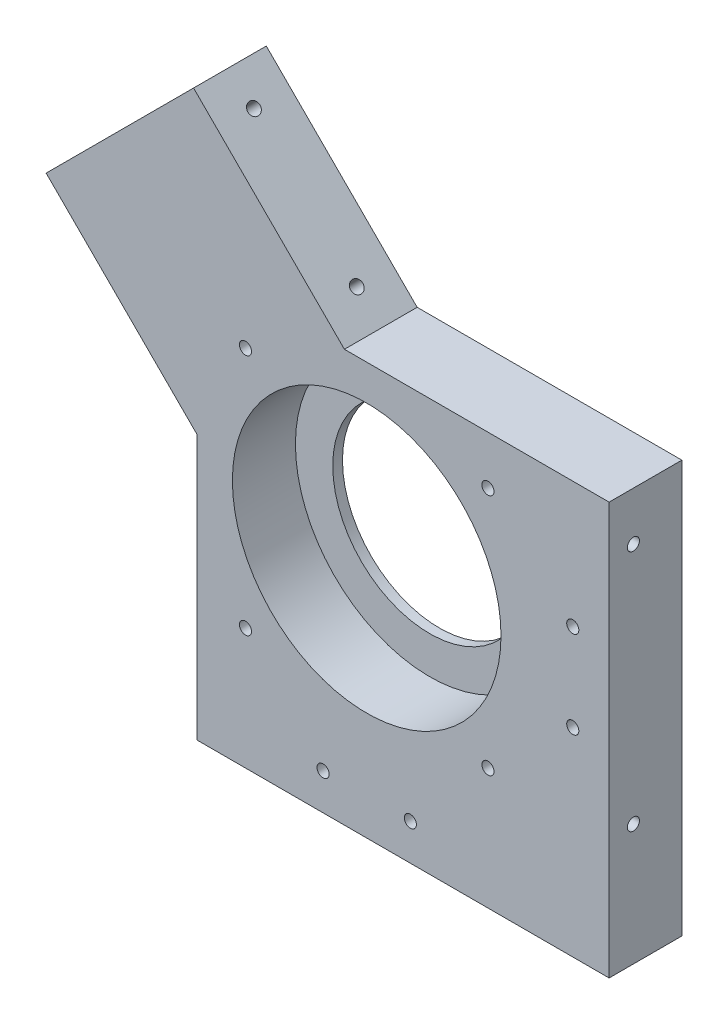
ISO-10303-21;
HEADER;
FILE_DESCRIPTION(('STEP AP214'),'2;1');
FILE_NAME('part.step','',(''),(''),'','','');
FILE_SCHEMA(('AUTOMOTIVE_DESIGN { 1 0 10303 214 1 1 1 1 }'));
ENDSEC;
DATA;
#1=APPLICATION_CONTEXT('core data for automotive mechanical design processes');
#2=APPLICATION_PROTOCOL_DEFINITION('international standard','automotive_design',2000,#1);
#3=PRODUCT_CONTEXT('',#1,'mechanical');
#4=PRODUCT('Part','Part','',(#3));
#5=PRODUCT_RELATED_PRODUCT_CATEGORY('part','',(#4));
#6=PRODUCT_DEFINITION_FORMATION('','',#4);
#7=PRODUCT_DEFINITION_CONTEXT('part definition',#1,'design');
#8=PRODUCT_DEFINITION('design','',#6,#7);
#9=PRODUCT_DEFINITION_SHAPE('','',#8);
#10=(LENGTH_UNIT() NAMED_UNIT(*) SI_UNIT(.MILLI.,.METRE.));
#11=(NAMED_UNIT(*) PLANE_ANGLE_UNIT() SI_UNIT($,.RADIAN.));
#12=(NAMED_UNIT(*) SI_UNIT($,.STERADIAN.) SOLID_ANGLE_UNIT());
#13=UNCERTAINTY_MEASURE_WITH_UNIT(LENGTH_MEASURE(1.E-05),#10,'distance_accuracy_value','');
#14=(GEOMETRIC_REPRESENTATION_CONTEXT(3) GLOBAL_UNCERTAINTY_ASSIGNED_CONTEXT((#13)) GLOBAL_UNIT_ASSIGNED_CONTEXT((#10,
#11,#12)) REPRESENTATION_CONTEXT('',''));
#15=CARTESIAN_POINT('',(0.,0.,0.));
#16=DIRECTION('',(0.,0.,1.));
#17=DIRECTION('',(1.,0.,0.));
#18=AXIS2_PLACEMENT_3D('',#15,#16,#17);
#19=CARTESIAN_POINT('',(0.,0.,15.));
#20=DIRECTION('',(0.,0.,-1.));
#21=DIRECTION('',(-1.,0.,0.));
#22=AXIS2_PLACEMENT_3D('',#19,#20,#21);
#23=CYLINDRICAL_SURFACE('',#22,27.7);
#24=CARTESIAN_POINT('',(0.,0.,15.));
#25=DIRECTION('',(0.,0.,1.));
#26=DIRECTION('',(1.,0.,0.));
#27=AXIS2_PLACEMENT_3D('',#24,#25,#26);
#28=CIRCLE('',#27,27.7);
#29=CARTESIAN_POINT('',(27.7,0.,15.));
#30=VERTEX_POINT('',#29);
#31=EDGE_CURVE('E129',#30,#30,#28,.T.);
#32=ORIENTED_EDGE('',*,*,#31,.T.);
#33=EDGE_LOOP('',(#32));
#34=FACE_BOUND('',#33,.T.);
#35=CARTESIAN_POINT('',(0.,0.,2.));
#36=DIRECTION('',(0.,0.,-1.));
#37=DIRECTION('',(-1.,0.,0.));
#38=AXIS2_PLACEMENT_3D('',#35,#36,#37);
#39=CIRCLE('',#38,27.7);
#40=CARTESIAN_POINT('',(-27.7,0.,2.));
#41=VERTEX_POINT('',#40);
#42=EDGE_CURVE('E232',#41,#41,#39,.T.);
#43=ORIENTED_EDGE('',*,*,#42,.T.);
#44=EDGE_LOOP('',(#43));
#45=FACE_BOUND('',#44,.T.);
#46=ADVANCED_FACE('F33',(#34,#45),#23,.F.);
#47=CARTESIAN_POINT('',(0.,0.,15.));
#48=DIRECTION('',(0.,0.,-1.));
#49=DIRECTION('',(-1.,0.,0.));
#50=AXIS2_PLACEMENT_3D('',#47,#48,#49);
#51=PLANE('',#50);
#52=DIRECTION('',(-1.,0.,0.));
#53=VECTOR('',#52,1.);
#54=CARTESIAN_POINT('',(-4.59440840897849,35.,15.));
#55=LINE('',#54,#53);
#56=CARTESIAN_POINT('',(50.,35.,15.));
#57=VERTEX_POINT('',#56);
#58=CARTESIAN_POINT('',(-4.59440840897849,35.,15.));
#59=VERTEX_POINT('',#58);
#60=EDGE_CURVE('E139',#57,#59,#55,.T.);
#61=ORIENTED_EDGE('',*,*,#60,.T.);
#62=DIRECTION('',(-0.707106781186547,0.707106781186548,0.));
#63=VECTOR('',#62,1.);
#64=CARTESIAN_POINT('',(-35.7088924499206,66.1144840409422,15.));
#65=LINE('',#64,#63);
#66=CARTESIAN_POINT('',(-35.7088924499206,66.1144840409422,15.));
#67=VERTEX_POINT('',#66);
#68=EDGE_CURVE('E90',#59,#67,#65,.T.);
#69=ORIENTED_EDGE('',*,*,#68,.T.);
#70=DIRECTION('',(-0.707106781186548,-0.707106781186547,0.));
#71=VECTOR('',#70,1.);
#72=CARTESIAN_POINT('',(-50.9116882454314,50.9116882454314,15.));
#73=LINE('',#72,#71);
#74=CARTESIAN_POINT('',(-66.1144840409422,35.7088924499207,15.));
#75=VERTEX_POINT('',#74);
#76=EDGE_CURVE('E150',#67,#75,#73,.T.);
#77=ORIENTED_EDGE('',*,*,#76,.T.);
#78=DIRECTION('',(0.707106781186547,-0.707106781186548,0.));
#79=VECTOR('',#78,1.);
#80=CARTESIAN_POINT('',(-66.1144840409422,35.7088924499207,15.));
#81=LINE('',#80,#79);
#82=CARTESIAN_POINT('',(-35.,4.59440840897844,15.));
#83=VERTEX_POINT('',#82);
#84=EDGE_CURVE('E107',#75,#83,#81,.T.);
#85=ORIENTED_EDGE('',*,*,#84,.T.);
#86=DIRECTION('',(0.,-1.,0.));
#87=VECTOR('',#86,1.);
#88=CARTESIAN_POINT('',(-35.,-50.,15.));
#89=LINE('',#88,#87);
#90=CARTESIAN_POINT('',(-35.,-50.,15.));
#91=VERTEX_POINT('',#90);
#92=EDGE_CURVE('E100',#83,#91,#89,.T.);
#93=ORIENTED_EDGE('',*,*,#92,.T.);
#94=DIRECTION('',(1.,0.,0.));
#95=VECTOR('',#94,1.);
#96=CARTESIAN_POINT('',(50.,-50.,15.));
#97=LINE('',#96,#95);
#98=CARTESIAN_POINT('',(50.,-50.,15.));
#99=VERTEX_POINT('',#98);
#100=EDGE_CURVE('E105',#91,#99,#97,.T.);
#101=ORIENTED_EDGE('',*,*,#100,.T.);
#102=DIRECTION('',(0.,1.,0.));
#103=VECTOR('',#102,1.);
#104=CARTESIAN_POINT('',(50.,35.,15.));
#105=LINE('',#104,#103);
#106=EDGE_CURVE('E50',#99,#57,#105,.T.);
#107=ORIENTED_EDGE('',*,*,#106,.T.);
#108=EDGE_LOOP('',(#61,#69,#77,#85,#93,#101,#107));
#109=FACE_BOUND('',#108,.T.);
#110=ORIENTED_EDGE('',*,*,#31,.F.);
#111=EDGE_LOOP('',(#110));
#112=FACE_BOUND('',#111,.T.);
#113=CARTESIAN_POINT('',(42.5,9.,15.));
#114=DIRECTION('',(0.,0.,1.));
#115=DIRECTION('',(1.,0.,0.));
#116=AXIS2_PLACEMENT_3D('',#113,#114,#115);
#117=CIRCLE('',#116,1.25);
#118=CARTESIAN_POINT('',(43.75,9.,15.));
#119=VERTEX_POINT('',#118);
#120=EDGE_CURVE('E166',#119,#119,#117,.T.);
#121=ORIENTED_EDGE('',*,*,#120,.F.);
#122=EDGE_LOOP('',(#121));
#123=FACE_BOUND('',#122,.T.);
#124=CARTESIAN_POINT('',(-25.,25.,15.));
#125=DIRECTION('',(0.,0.,1.));
#126=DIRECTION('',(1.,0.,0.));
#127=AXIS2_PLACEMENT_3D('',#124,#125,#126);
#128=CIRCLE('',#127,1.25);
#129=CARTESIAN_POINT('',(-23.75,25.,15.));
#130=VERTEX_POINT('',#129);
#131=EDGE_CURVE('E170',#130,#130,#128,.T.);
#132=ORIENTED_EDGE('',*,*,#131,.F.);
#133=EDGE_LOOP('',(#132));
#134=FACE_BOUND('',#133,.T.);
#135=CARTESIAN_POINT('',(25.,25.,15.));
#136=DIRECTION('',(0.,0.,1.));
#137=DIRECTION('',(1.,0.,0.));
#138=AXIS2_PLACEMENT_3D('',#135,#136,#137);
#139=CIRCLE('',#138,1.25);
#140=CARTESIAN_POINT('',(26.25,25.,15.));
#141=VERTEX_POINT('',#140);
#142=EDGE_CURVE('E176',#141,#141,#139,.T.);
#143=ORIENTED_EDGE('',*,*,#142,.F.);
#144=EDGE_LOOP('',(#143));
#145=FACE_BOUND('',#144,.T.);
#146=CARTESIAN_POINT('',(25.,-25.,15.));
#147=DIRECTION('',(0.,0.,1.));
#148=DIRECTION('',(1.,0.,0.));
#149=AXIS2_PLACEMENT_3D('',#146,#147,#148);
#150=CIRCLE('',#149,1.25);
#151=CARTESIAN_POINT('',(26.25,-25.,15.));
#152=VERTEX_POINT('',#151);
#153=EDGE_CURVE('E182',#152,#152,#150,.T.);
#154=ORIENTED_EDGE('',*,*,#153,.F.);
#155=EDGE_LOOP('',(#154));
#156=FACE_BOUND('',#155,.T.);
#157=CARTESIAN_POINT('',(-25.,-25.,15.));
#158=DIRECTION('',(0.,0.,1.));
#159=DIRECTION('',(1.,0.,0.));
#160=AXIS2_PLACEMENT_3D('',#157,#158,#159);
#161=CIRCLE('',#160,1.25);
#162=CARTESIAN_POINT('',(-23.75,-25.,15.));
#163=VERTEX_POINT('',#162);
#164=EDGE_CURVE('E188',#163,#163,#161,.T.);
#165=ORIENTED_EDGE('',*,*,#164,.F.);
#166=EDGE_LOOP('',(#165));
#167=FACE_BOUND('',#166,.T.);
#168=CARTESIAN_POINT('',(42.5,-9.,15.));
#169=DIRECTION('',(0.,0.,1.));
#170=DIRECTION('',(1.,0.,0.));
#171=AXIS2_PLACEMENT_3D('',#168,#169,#170);
#172=CIRCLE('',#171,1.25);
#173=CARTESIAN_POINT('',(43.75,-9.,15.));
#174=VERTEX_POINT('',#173);
#175=EDGE_CURVE('E194',#174,#174,#172,.T.);
#176=ORIENTED_EDGE('',*,*,#175,.F.);
#177=EDGE_LOOP('',(#176));
#178=FACE_BOUND('',#177,.T.);
#179=CARTESIAN_POINT('',(9.00000000000001,-42.5,15.));
#180=DIRECTION('',(0.,0.,1.));
#181=DIRECTION('',(1.,0.,0.));
#182=AXIS2_PLACEMENT_3D('',#179,#180,#181);
#183=CIRCLE('',#182,1.25);
#184=CARTESIAN_POINT('',(10.25,-42.5,15.));
#185=VERTEX_POINT('',#184);
#186=EDGE_CURVE('E200',#185,#185,#183,.T.);
#187=ORIENTED_EDGE('',*,*,#186,.F.);
#188=EDGE_LOOP('',(#187));
#189=FACE_BOUND('',#188,.T.);
#190=CARTESIAN_POINT('',(-8.99999999999999,-42.5,15.));
#191=DIRECTION('',(0.,0.,1.));
#192=DIRECTION('',(1.,0.,0.));
#193=AXIS2_PLACEMENT_3D('',#190,#191,#192);
#194=CIRCLE('',#193,1.25);
#195=CARTESIAN_POINT('',(-7.74999999999999,-42.5,15.));
#196=VERTEX_POINT('',#195);
#197=EDGE_CURVE('E206',#196,#196,#194,.T.);
#198=ORIENTED_EDGE('',*,*,#197,.F.);
#199=EDGE_LOOP('',(#198));
#200=FACE_BOUND('',#199,.T.);
#201=ADVANCED_FACE('F102',(#109,#112,#123,#134,#145,#156,#167,#178,#189,#200),#51,.F.);
#202=CARTESIAN_POINT('',(0.,0.,0.));
#203=DIRECTION('',(0.,0.,-1.));
#204=DIRECTION('',(-1.,0.,0.));
#205=AXIS2_PLACEMENT_3D('',#202,#203,#204);
#206=PLANE('',#205);
#207=CARTESIAN_POINT('',(9.00000000000001,-42.5,0.));
#208=DIRECTION('',(0.,0.,1.));
#209=DIRECTION('',(1.,0.,0.));
#210=AXIS2_PLACEMENT_3D('',#207,#208,#209);
#211=CIRCLE('',#210,1.25);
#212=CARTESIAN_POINT('',(10.25,-42.5,0.));
#213=VERTEX_POINT('',#212);
#214=EDGE_CURVE('E203',#213,#213,#211,.T.);
#215=ORIENTED_EDGE('',*,*,#214,.T.);
#216=EDGE_LOOP('',(#215));
#217=FACE_BOUND('',#216,.T.);
#218=CARTESIAN_POINT('',(-25.,-25.,0.));
#219=DIRECTION('',(0.,0.,1.));
#220=DIRECTION('',(1.,0.,0.));
#221=AXIS2_PLACEMENT_3D('',#218,#219,#220);
#222=CIRCLE('',#221,1.25);
#223=CARTESIAN_POINT('',(-23.75,-25.,0.));
#224=VERTEX_POINT('',#223);
#225=EDGE_CURVE('E191',#224,#224,#222,.T.);
#226=ORIENTED_EDGE('',*,*,#225,.T.);
#227=EDGE_LOOP('',(#226));
#228=FACE_BOUND('',#227,.T.);
#229=CARTESIAN_POINT('',(25.,25.,0.));
#230=DIRECTION('',(0.,0.,1.));
#231=DIRECTION('',(1.,0.,0.));
#232=AXIS2_PLACEMENT_3D('',#229,#230,#231);
#233=CIRCLE('',#232,1.25);
#234=CARTESIAN_POINT('',(26.25,25.,0.));
#235=VERTEX_POINT('',#234);
#236=EDGE_CURVE('E179',#235,#235,#233,.T.);
#237=ORIENTED_EDGE('',*,*,#236,.T.);
#238=EDGE_LOOP('',(#237));
#239=FACE_BOUND('',#238,.T.);
#240=CARTESIAN_POINT('',(42.5,9.,0.));
#241=DIRECTION('',(0.,0.,1.));
#242=DIRECTION('',(1.,0.,0.));
#243=AXIS2_PLACEMENT_3D('',#240,#241,#242);
#244=CIRCLE('',#243,1.25);
#245=CARTESIAN_POINT('',(43.75,9.,0.));
#246=VERTEX_POINT('',#245);
#247=EDGE_CURVE('E167',#246,#246,#244,.T.);
#248=ORIENTED_EDGE('',*,*,#247,.T.);
#249=EDGE_LOOP('',(#248));
#250=FACE_BOUND('',#249,.T.);
#251=DIRECTION('',(-1.,0.,0.));
#252=VECTOR('',#251,1.);
#253=CARTESIAN_POINT('',(-4.59440840897849,35.,0.));
#254=LINE('',#253,#252);
#255=CARTESIAN_POINT('',(50.,35.,0.));
#256=VERTEX_POINT('',#255);
#257=CARTESIAN_POINT('',(-4.59440840897849,35.,0.));
#258=VERTEX_POINT('',#257);
#259=EDGE_CURVE('E125',#256,#258,#254,.T.);
#260=ORIENTED_EDGE('',*,*,#259,.F.);
#261=DIRECTION('',(0.,1.,0.));
#262=VECTOR('',#261,1.);
#263=CARTESIAN_POINT('',(50.,35.,0.));
#264=LINE('',#263,#262);
#265=CARTESIAN_POINT('',(50.,-50.,0.));
#266=VERTEX_POINT('',#265);
#267=EDGE_CURVE('E82',#266,#256,#264,.T.);
#268=ORIENTED_EDGE('',*,*,#267,.F.);
#269=DIRECTION('',(1.,0.,0.));
#270=VECTOR('',#269,1.);
#271=CARTESIAN_POINT('',(50.,-50.,0.));
#272=LINE('',#271,#270);
#273=CARTESIAN_POINT('',(-35.,-50.,0.));
#274=VERTEX_POINT('',#273);
#275=EDGE_CURVE('E76',#274,#266,#272,.T.);
#276=ORIENTED_EDGE('',*,*,#275,.F.);
#277=DIRECTION('',(0.,-1.,0.));
#278=VECTOR('',#277,1.);
#279=CARTESIAN_POINT('',(-35.,-50.,0.));
#280=LINE('',#279,#278);
#281=CARTESIAN_POINT('',(-35.,4.59440840897844,0.));
#282=VERTEX_POINT('',#281);
#283=EDGE_CURVE('E115',#282,#274,#280,.T.);
#284=ORIENTED_EDGE('',*,*,#283,.F.);
#285=DIRECTION('',(0.707106781186547,-0.707106781186548,0.));
#286=VECTOR('',#285,1.);
#287=CARTESIAN_POINT('',(-66.1144840409422,35.7088924499207,0.));
#288=LINE('',#287,#286);
#289=CARTESIAN_POINT('',(-66.1144840409422,35.7088924499207,0.));
#290=VERTEX_POINT('',#289);
#291=EDGE_CURVE('E134',#290,#282,#288,.T.);
#292=ORIENTED_EDGE('',*,*,#291,.F.);
#293=DIRECTION('',(-0.707106781186548,-0.707106781186547,0.));
#294=VECTOR('',#293,1.);
#295=CARTESIAN_POINT('',(-50.9116882454314,50.9116882454314,0.));
#296=LINE('',#295,#294);
#297=CARTESIAN_POINT('',(-35.7088924499206,66.1144840409422,0.));
#298=VERTEX_POINT('',#297);
#299=EDGE_CURVE('E132',#298,#290,#296,.T.);
#300=ORIENTED_EDGE('',*,*,#299,.F.);
#301=DIRECTION('',(-0.707106781186547,0.707106781186548,0.));
#302=VECTOR('',#301,1.);
#303=CARTESIAN_POINT('',(-35.7088924499206,66.1144840409422,0.));
#304=LINE('',#303,#302);
#305=EDGE_CURVE('E128',#258,#298,#304,.T.);
#306=ORIENTED_EDGE('',*,*,#305,.F.);
#307=EDGE_LOOP('',(#260,#268,#276,#284,#292,#300,#306));
#308=FACE_BOUND('',#307,.T.);
#309=CARTESIAN_POINT('',(-25.,25.,0.));
#310=DIRECTION('',(0.,0.,1.));
#311=DIRECTION('',(1.,0.,0.));
#312=AXIS2_PLACEMENT_3D('',#309,#310,#311);
#313=CIRCLE('',#312,1.25);
#314=CARTESIAN_POINT('',(-23.75,25.,0.));
#315=VERTEX_POINT('',#314);
#316=EDGE_CURVE('E173',#315,#315,#313,.T.);
#317=ORIENTED_EDGE('',*,*,#316,.T.);
#318=EDGE_LOOP('',(#317));
#319=FACE_BOUND('',#318,.T.);
#320=CARTESIAN_POINT('',(25.,-25.,0.));
#321=DIRECTION('',(0.,0.,1.));
#322=DIRECTION('',(1.,0.,0.));
#323=AXIS2_PLACEMENT_3D('',#320,#321,#322);
#324=CIRCLE('',#323,1.25);
#325=CARTESIAN_POINT('',(26.25,-25.,0.));
#326=VERTEX_POINT('',#325);
#327=EDGE_CURVE('E185',#326,#326,#324,.T.);
#328=ORIENTED_EDGE('',*,*,#327,.T.);
#329=EDGE_LOOP('',(#328));
#330=FACE_BOUND('',#329,.T.);
#331=CARTESIAN_POINT('',(42.5,-9.,0.));
#332=DIRECTION('',(0.,0.,1.));
#333=DIRECTION('',(1.,0.,0.));
#334=AXIS2_PLACEMENT_3D('',#331,#332,#333);
#335=CIRCLE('',#334,1.25);
#336=CARTESIAN_POINT('',(43.75,-9.,0.));
#337=VERTEX_POINT('',#336);
#338=EDGE_CURVE('E197',#337,#337,#335,.T.);
#339=ORIENTED_EDGE('',*,*,#338,.T.);
#340=EDGE_LOOP('',(#339));
#341=FACE_BOUND('',#340,.T.);
#342=CARTESIAN_POINT('',(-8.99999999999999,-42.5,0.));
#343=DIRECTION('',(0.,0.,1.));
#344=DIRECTION('',(1.,0.,0.));
#345=AXIS2_PLACEMENT_3D('',#342,#343,#344);
#346=CIRCLE('',#345,1.25);
#347=CARTESIAN_POINT('',(-7.74999999999999,-42.5,0.));
#348=VERTEX_POINT('',#347);
#349=EDGE_CURVE('E209',#348,#348,#346,.T.);
#350=ORIENTED_EDGE('',*,*,#349,.T.);
#351=EDGE_LOOP('',(#350));
#352=FACE_BOUND('',#351,.T.);
#353=CARTESIAN_POINT('',(0.,0.,0.));
#354=DIRECTION('',(0.,0.,-1.));
#355=DIRECTION('',(-1.,0.,0.));
#356=AXIS2_PLACEMENT_3D('',#353,#354,#355);
#357=CIRCLE('',#356,20.);
#358=CARTESIAN_POINT('',(-20.,0.,0.));
#359=VERTEX_POINT('',#358);
#360=EDGE_CURVE('E371',#359,#359,#357,.T.);
#361=ORIENTED_EDGE('',*,*,#360,.F.);
#362=EDGE_LOOP('',(#361));
#363=FACE_BOUND('',#362,.T.);
#364=ADVANCED_FACE('F155',(#217,#228,#239,#250,#308,#319,#330,#341,#352,#363),#206,.T.);
#365=CARTESIAN_POINT('',(-4.59440840897849,35.,15.));
#366=DIRECTION('',(0.,-1.,0.));
#367=DIRECTION('',(0.,0.,-1.));
#368=AXIS2_PLACEMENT_3D('',#365,#366,#367);
#369=PLANE('',#368);
#370=ORIENTED_EDGE('',*,*,#259,.T.);
#371=DIRECTION('',(0.,0.,-1.));
#372=VECTOR('',#371,1.);
#373=CARTESIAN_POINT('',(-4.59440840897849,35.,15.));
#374=LINE('',#373,#372);
#375=EDGE_CURVE('E11',#59,#258,#374,.T.);
#376=ORIENTED_EDGE('',*,*,#375,.F.);
#377=ORIENTED_EDGE('',*,*,#60,.F.);
#378=DIRECTION('',(0.,0.,-1.));
#379=VECTOR('',#378,1.);
#380=CARTESIAN_POINT('',(50.,35.,15.));
#381=LINE('',#380,#379);
#382=EDGE_CURVE('E121',#57,#256,#381,.T.);
#383=ORIENTED_EDGE('',*,*,#382,.T.);
#384=EDGE_LOOP('',(#370,#376,#377,#383));
#385=FACE_BOUND('',#384,.T.);
#386=ADVANCED_FACE('F35',(#385),#369,.F.);
#387=CARTESIAN_POINT('',(-35.7088924499206,66.1144840409422,15.));
#388=DIRECTION('',(-0.707106781186548,-0.707106781186547,0.));
#389=DIRECTION('',(0.707106781186547,-0.707106781186548,0.));
#390=AXIS2_PLACEMENT_3D('',#387,#388,#389);
#391=PLANE('',#390);
#392=CARTESIAN_POINT('',(-9.54594154601842,39.9515331370399,7.5));
#393=DIRECTION('',(-0.707106781186548,-0.707106781186547,0.));
#394=DIRECTION('',(0.707106781186547,-0.707106781186548,0.));
#395=AXIS2_PLACEMENT_3D('',#392,#393,#394);
#396=CIRCLE('',#395,1.25);
#397=CARTESIAN_POINT('',(-8.66205806953524,39.0676496605568,7.5));
#398=VERTEX_POINT('',#397);
#399=EDGE_CURVE('E220',#398,#398,#396,.F.);
#400=ORIENTED_EDGE('',*,*,#399,.F.);
#401=EDGE_LOOP('',(#400));
#402=FACE_BOUND('',#401,.T.);
#403=CARTESIAN_POINT('',(-30.7591449816148,61.1647365726364,7.5));
#404=DIRECTION('',(-0.707106781186548,-0.707106781186547,0.));
#405=DIRECTION('',(0.707106781186547,-0.707106781186548,0.));
#406=AXIS2_PLACEMENT_3D('',#403,#404,#405);
#407=CIRCLE('',#406,1.25);
#408=CARTESIAN_POINT('',(-29.8752615051316,60.2808530961532,7.5));
#409=VERTEX_POINT('',#408);
#410=EDGE_CURVE('E212',#409,#409,#407,.F.);
#411=ORIENTED_EDGE('',*,*,#410,.F.);
#412=EDGE_LOOP('',(#411));
#413=FACE_BOUND('',#412,.T.);
#414=ORIENTED_EDGE('',*,*,#305,.T.);
#415=DIRECTION('',(0.,0.,-1.));
#416=VECTOR('',#415,1.);
#417=CARTESIAN_POINT('',(-35.7088924499206,66.1144840409422,15.));
#418=LINE('',#417,#416);
#419=EDGE_CURVE('E42',#67,#298,#418,.T.);
#420=ORIENTED_EDGE('',*,*,#419,.F.);
#421=ORIENTED_EDGE('',*,*,#68,.F.);
#422=ORIENTED_EDGE('',*,*,#375,.T.);
#423=EDGE_LOOP('',(#414,#420,#421,#422));
#424=FACE_BOUND('',#423,.T.);
#425=ADVANCED_FACE('F151',(#402,#413,#424),#391,.F.);
#426=CARTESIAN_POINT('',(-50.9116882454314,50.9116882454314,15.));
#427=DIRECTION('',(0.707106781186547,-0.707106781186548,0.));
#428=DIRECTION('',(0.707106781186548,0.707106781186547,0.));
#429=AXIS2_PLACEMENT_3D('',#426,#427,#428);
#430=PLANE('',#429);
#431=ORIENTED_EDGE('',*,*,#299,.T.);
#432=DIRECTION('',(0.,0.,-1.));
#433=VECTOR('',#432,1.);
#434=CARTESIAN_POINT('',(-66.1144840409422,35.7088924499207,15.));
#435=LINE('',#434,#433);
#436=EDGE_CURVE('E143',#75,#290,#435,.T.);
#437=ORIENTED_EDGE('',*,*,#436,.F.);
#438=ORIENTED_EDGE('',*,*,#76,.F.);
#439=ORIENTED_EDGE('',*,*,#419,.T.);
#440=EDGE_LOOP('',(#431,#437,#438,#439));
#441=FACE_BOUND('',#440,.T.);
#442=ADVANCED_FACE('F148',(#441),#430,.F.);
#443=CARTESIAN_POINT('',(-66.1144840409422,35.7088924499207,15.));
#444=DIRECTION('',(0.707106781186548,0.707106781186547,0.));
#445=DIRECTION('',(-0.707106781186547,0.707106781186548,0.));
#446=AXIS2_PLACEMENT_3D('',#443,#444,#445);
#447=PLANE('',#446);
#448=CARTESIAN_POINT('',(-39.95153313704,9.54594154601836,7.5));
#449=DIRECTION('',(-0.707106781186547,-0.707106781186548,0.));
#450=DIRECTION('',(0.707106781186548,-0.707106781186547,0.));
#451=AXIS2_PLACEMENT_3D('',#448,#449,#450);
#452=CIRCLE('',#451,1.25);
#453=CARTESIAN_POINT('',(-39.0676496605568,8.66205806953517,7.5));
#454=VERTEX_POINT('',#453);
#455=EDGE_CURVE('E223',#454,#454,#452,.T.);
#456=ORIENTED_EDGE('',*,*,#455,.F.);
#457=EDGE_LOOP('',(#456));
#458=FACE_BOUND('',#457,.T.);
#459=CARTESIAN_POINT('',(-61.1647365726364,30.7591449816148,7.5));
#460=DIRECTION('',(-0.707106781186547,-0.707106781186548,0.));
#461=DIRECTION('',(0.707106781186548,-0.707106781186547,0.));
#462=AXIS2_PLACEMENT_3D('',#459,#460,#461);
#463=CIRCLE('',#462,1.25);
#464=CARTESIAN_POINT('',(-60.2808530961532,29.8752615051316,7.5));
#465=VERTEX_POINT('',#464);
#466=EDGE_CURVE('E217',#465,#465,#463,.T.);
#467=ORIENTED_EDGE('',*,*,#466,.F.);
#468=EDGE_LOOP('',(#467));
#469=FACE_BOUND('',#468,.T.);
#470=ORIENTED_EDGE('',*,*,#291,.T.);
#471=DIRECTION('',(0.,0.,-1.));
#472=VECTOR('',#471,1.);
#473=CARTESIAN_POINT('',(-35.,4.59440840897844,15.));
#474=LINE('',#473,#472);
#475=EDGE_CURVE('E116',#83,#282,#474,.T.);
#476=ORIENTED_EDGE('',*,*,#475,.F.);
#477=ORIENTED_EDGE('',*,*,#84,.F.);
#478=ORIENTED_EDGE('',*,*,#436,.T.);
#479=EDGE_LOOP('',(#470,#476,#477,#478));
#480=FACE_BOUND('',#479,.T.);
#481=ADVANCED_FACE('F159',(#458,#469,#480),#447,.F.);
#482=CARTESIAN_POINT('',(-35.,-50.,15.));
#483=DIRECTION('',(1.,0.,0.));
#484=DIRECTION('',(0.,0.,-1.));
#485=AXIS2_PLACEMENT_3D('',#482,#483,#484);
#486=PLANE('',#485);
#487=ORIENTED_EDGE('',*,*,#283,.T.);
#488=DIRECTION('',(0.,0.,-1.));
#489=VECTOR('',#488,1.);
#490=CARTESIAN_POINT('',(-35.,-50.,15.));
#491=LINE('',#490,#489);
#492=EDGE_CURVE('E112',#91,#274,#491,.T.);
#493=ORIENTED_EDGE('',*,*,#492,.F.);
#494=ORIENTED_EDGE('',*,*,#92,.F.);
#495=ORIENTED_EDGE('',*,*,#475,.T.);
#496=EDGE_LOOP('',(#487,#493,#494,#495));
#497=FACE_BOUND('',#496,.T.);
#498=ADVANCED_FACE('F113',(#497),#486,.F.);
#499=CARTESIAN_POINT('',(50.,-50.,15.));
#500=DIRECTION('',(0.,1.,0.));
#501=DIRECTION('',(-1.,0.,0.));
#502=AXIS2_PLACEMENT_3D('',#499,#500,#501);
#503=PLANE('',#502);
#504=CARTESIAN_POINT('',(25.,-50.,10.));
#505=DIRECTION('',(0.,-1.,0.));
#506=DIRECTION('',(1.,0.,0.));
#507=AXIS2_PLACEMENT_3D('',#504,#505,#506);
#508=CIRCLE('',#507,1.25);
#509=CARTESIAN_POINT('',(26.25,-50.,10.));
#510=VERTEX_POINT('',#509);
#511=EDGE_CURVE('E379',#510,#510,#508,.T.);
#512=ORIENTED_EDGE('',*,*,#511,.F.);
#513=EDGE_LOOP('',(#512));
#514=FACE_BOUND('',#513,.T.);
#515=CARTESIAN_POINT('',(-25.,-50.,10.));
#516=DIRECTION('',(0.,-1.,0.));
#517=DIRECTION('',(1.,0.,0.));
#518=AXIS2_PLACEMENT_3D('',#515,#516,#517);
#519=CIRCLE('',#518,1.25);
#520=CARTESIAN_POINT('',(-23.75,-50.,10.));
#521=VERTEX_POINT('',#520);
#522=EDGE_CURVE('E385',#521,#521,#519,.T.);
#523=ORIENTED_EDGE('',*,*,#522,.F.);
#524=EDGE_LOOP('',(#523));
#525=FACE_BOUND('',#524,.T.);
#526=ORIENTED_EDGE('',*,*,#275,.T.);
#527=DIRECTION('',(0.,0.,-1.));
#528=VECTOR('',#527,1.);
#529=CARTESIAN_POINT('',(50.,-50.,15.));
#530=LINE('',#529,#528);
#531=EDGE_CURVE('E117',#99,#266,#530,.T.);
#532=ORIENTED_EDGE('',*,*,#531,.F.);
#533=ORIENTED_EDGE('',*,*,#100,.F.);
#534=ORIENTED_EDGE('',*,*,#492,.T.);
#535=EDGE_LOOP('',(#526,#532,#533,#534));
#536=FACE_BOUND('',#535,.T.);
#537=ADVANCED_FACE('F119',(#514,#525,#536),#503,.F.);
#538=CARTESIAN_POINT('',(50.,35.,15.));
#539=DIRECTION('',(-1.,0.,0.));
#540=DIRECTION('',(0.,-1.,0.));
#541=AXIS2_PLACEMENT_3D('',#538,#539,#540);
#542=PLANE('',#541);
#543=CARTESIAN_POINT('',(50.,-25.,10.));
#544=DIRECTION('',(1.,0.,0.));
#545=DIRECTION('',(0.,1.,0.));
#546=AXIS2_PLACEMENT_3D('',#543,#544,#545);
#547=CIRCLE('',#546,1.25);
#548=CARTESIAN_POINT('',(50.,-23.75,10.));
#549=VERTEX_POINT('',#548);
#550=EDGE_CURVE('E400',#549,#549,#547,.T.);
#551=ORIENTED_EDGE('',*,*,#550,.F.);
#552=EDGE_LOOP('',(#551));
#553=FACE_BOUND('',#552,.T.);
#554=CARTESIAN_POINT('',(50.,25.,10.));
#555=DIRECTION('',(1.,0.,0.));
#556=DIRECTION('',(0.,1.,0.));
#557=AXIS2_PLACEMENT_3D('',#554,#555,#556);
#558=CIRCLE('',#557,1.25);
#559=CARTESIAN_POINT('',(50.,26.25,10.));
#560=VERTEX_POINT('',#559);
#561=EDGE_CURVE('E394',#560,#560,#558,.T.);
#562=ORIENTED_EDGE('',*,*,#561,.F.);
#563=EDGE_LOOP('',(#562));
#564=FACE_BOUND('',#563,.T.);
#565=ORIENTED_EDGE('',*,*,#267,.T.);
#566=ORIENTED_EDGE('',*,*,#382,.F.);
#567=ORIENTED_EDGE('',*,*,#106,.F.);
#568=ORIENTED_EDGE('',*,*,#531,.T.);
#569=EDGE_LOOP('',(#565,#566,#567,#568));
#570=FACE_BOUND('',#569,.T.);
#571=ADVANCED_FACE('F297',(#553,#564,#570),#542,.F.);
#572=CARTESIAN_POINT('',(42.5,9.,15.));
#573=DIRECTION('',(0.,0.,-1.));
#574=DIRECTION('',(-1.,0.,0.));
#575=AXIS2_PLACEMENT_3D('',#572,#573,#574);
#576=CYLINDRICAL_SURFACE('',#575,1.25);
#577=ORIENTED_EDGE('',*,*,#120,.T.);
#578=EDGE_LOOP('',(#577));
#579=FACE_BOUND('',#578,.T.);
#580=ORIENTED_EDGE('',*,*,#247,.F.);
#581=EDGE_LOOP('',(#580));
#582=FACE_BOUND('',#581,.T.);
#583=ADVANCED_FACE('F291',(#579,#582),#576,.F.);
#584=CARTESIAN_POINT('',(-25.,25.,15.));
#585=DIRECTION('',(0.,0.,-1.));
#586=DIRECTION('',(-1.,0.,0.));
#587=AXIS2_PLACEMENT_3D('',#584,#585,#586);
#588=CYLINDRICAL_SURFACE('',#587,1.25);
#589=CARTESIAN_POINT('',(-26.25,25.,7.66379104596794));
#590=CARTESIAN_POINT('',(-26.2500035293844,25.01012924831,7.60955250979738));
#591=CARTESIAN_POINT('',(-26.2499053669214,25.015386766703,7.55436354506678));
#592=CARTESIAN_POINT('',(-26.2499064881487,25.0152838911567,7.44399819788223));
#593=CARTESIAN_POINT('',(-26.2500057704213,25.0099235734561,7.38882181534077));
#594=CARTESIAN_POINT('',(-26.2499941963562,24.9895421479646,7.28075013245616));
#595=CARTESIAN_POINT('',(-26.2498847773902,24.9745875884319,7.22784177686947));
#596=CARTESIAN_POINT('',(-26.2485477557107,24.9368975726133,7.1248594563894));
#597=CARTESIAN_POINT('',(-26.2473179109245,24.9141465719199,7.0747913886525));
#598=CARTESIAN_POINT('',(-26.2417507474333,24.8520886540509,6.95798949991824));
#599=CARTESIAN_POINT('',(-26.2363424838186,24.809821944777,6.89288138872972));
#600=CARTESIAN_POINT('',(-26.218520428493,24.7172635689606,6.76961409828382));
#601=CARTESIAN_POINT('',(-26.2060950126983,24.6669586863895,6.71146664372494));
#602=CARTESIAN_POINT('',(-26.1716129027921,24.5607036123653,6.60245743466193));
#603=CARTESIAN_POINT('',(-26.1494577742291,24.5047003405962,6.55167739010538));
#604=CARTESIAN_POINT('',(-26.0932697121281,24.3906849648842,6.46000031257678));
#605=CARTESIAN_POINT('',(-26.0592787736849,24.3326806081056,6.41906919127148));
#606=CARTESIAN_POINT('',(-25.9913979567703,24.2372010788469,6.36072273144471));
#607=CARTESIAN_POINT('',(-25.9610847953226,24.1991957019861,6.33999084762299));
#608=CARTESIAN_POINT('',(-25.8945665499209,24.1255257847209,6.30472029202119));
#609=CARTESIAN_POINT('',(-25.8583658263489,24.0898595391591,6.29017706547506));
#610=CARTESIAN_POINT('',(-25.7805533662074,24.0222993923776,6.26766514310768));
#611=CARTESIAN_POINT('',(-25.7389255060929,23.9904172953211,6.25971657932482));
#612=CARTESIAN_POINT('',(-25.6514671393737,23.9318896831068,6.25040041355374));
#613=CARTESIAN_POINT('',(-25.6056360659127,23.9052448757913,6.2490337005451));
#614=CARTESIAN_POINT('',(-25.5131366032098,23.8590556224891,6.25221743288743));
#615=CARTESIAN_POINT('',(-25.466582744186,23.8392615086932,6.25652361025127));
#616=CARTESIAN_POINT('',(-25.3720359694031,23.8055912226091,6.26977568602009));
#617=CARTESIAN_POINT('',(-25.3240423890005,23.7917178300441,6.27872375939355));
#618=CARTESIAN_POINT('',(-25.2100676756842,23.765937823461,6.30417617188694));
#619=CARTESIAN_POINT('',(-25.1438624996133,23.756559903638,6.32224317069616));
#620=CARTESIAN_POINT('',(-25.0120579963479,23.7483070617174,6.36258814371947));
#621=CARTESIAN_POINT('',(-24.9464600480509,23.7494519911768,6.38487399932168));
#622=CARTESIAN_POINT('',(-24.8158331681132,23.7618743554181,6.43143365166907));
#623=CARTESIAN_POINT('',(-24.7508285245369,23.7733074344251,6.45573276130091));
#624=CARTESIAN_POINT('',(-24.6230038378613,23.8063797569824,6.50311997177016));
#625=CARTESIAN_POINT('',(-24.5601825904563,23.828013275133,6.52620874388931));
#626=CARTESIAN_POINT('',(-24.4494890951144,23.8764640223633,6.56355243800084));
#627=CARTESIAN_POINT('',(-24.401101004149,23.9014330137336,6.57865179781308));
#628=CARTESIAN_POINT('',(-24.3070798365015,23.9581924141813,6.60352307963245));
#629=CARTESIAN_POINT('',(-24.2614406199561,23.9899668393943,6.61330729804725));
#630=CARTESIAN_POINT('',(-24.1737999931414,24.0602823692525,6.62564001258731));
#631=CARTESIAN_POINT('',(-24.1318365459369,24.0988839091319,6.62812006595178));
#632=CARTESIAN_POINT('',(-24.0537145213197,24.1812977643675,6.62501656577845));
#633=CARTESIAN_POINT('',(-24.0175593841027,24.2251131412749,6.61942825286388));
#634=CARTESIAN_POINT('',(-23.9491618005241,24.3203065530108,6.60073164643721));
#635=CARTESIAN_POINT('',(-23.9175566057278,24.3720105397406,6.58699667857389));
#636=CARTESIAN_POINT('',(-23.8625475623122,24.4781796580819,6.55445460269561));
#637=CARTESIAN_POINT('',(-23.8391677308206,24.5326523526195,6.53563292038256));
#638=CARTESIAN_POINT('',(-23.7952649705753,24.658433631818,6.49032058382882));
#639=CARTESIAN_POINT('',(-23.7771889735856,24.7303401417892,6.46312681601417));
#640=CARTESIAN_POINT('',(-23.7539288943461,24.8764410476757,6.40950813086222));
#641=CARTESIAN_POINT('',(-23.7487345832082,24.9506335809107,6.38308261997008));
#642=CARTESIAN_POINT('',(-23.7514833771565,25.0855312917498,6.33954492842512));
#643=CARTESIAN_POINT('',(-23.7570443405093,25.1460202935218,6.32162314338856));
#644=CARTESIAN_POINT('',(-23.7772636767118,25.2667303415756,6.29070800185007));
#645=CARTESIAN_POINT('',(-23.7919075622219,25.3269516610539,6.27770684996563));
#646=CARTESIAN_POINT('',(-23.8273309629876,25.4359867401003,6.26011182961484));
#647=CARTESIAN_POINT('',(-23.8467445168627,25.4850771926926,6.2545019593146));
#648=CARTESIAN_POINT('',(-23.8917977431333,25.5806661612078,6.24913595272561));
#649=CARTESIAN_POINT('',(-23.9174339443534,25.6271661044737,6.24937656026409));
#650=CARTESIAN_POINT('',(-23.9742457887164,25.7163314483362,6.25640105816657));
#651=CARTESIAN_POINT('',(-24.0054381913278,25.7589846424567,6.26320502806422));
#652=CARTESIAN_POINT('',(-24.0720190597311,25.8390858756031,6.28355089130622));
#653=CARTESIAN_POINT('',(-24.1074079136197,25.8765334325039,6.29709340821652));
#654=CARTESIAN_POINT('',(-24.1791076741435,25.9438995396374,6.32977900329644));
#655=CARTESIAN_POINT('',(-24.2153005759423,25.974085874761,6.34863464137247));
#656=CARTESIAN_POINT('',(-24.2887417953461,26.0289395311152,6.39155364978838));
#657=CARTESIAN_POINT('',(-24.3259905933598,26.0536042932314,6.41561942477724));
#658=CARTESIAN_POINT('',(-24.4138035738193,26.1055906710114,6.47781145388253));
#659=CARTESIAN_POINT('',(-24.4643258557922,26.1306632659914,6.51787861669159));
#660=CARTESIAN_POINT('',(-24.5628196107958,26.1722813910717,6.60500687364491));
#661=CARTESIAN_POINT('',(-24.6107861184608,26.1888108291075,6.65208095298993));
#662=CARTESIAN_POINT('',(-24.7028049816909,26.2151116412619,6.75298232771707));
#663=CARTESIAN_POINT('',(-24.7467858779168,26.2247752830861,6.80690226725361));
#664=CARTESIAN_POINT('',(-24.8277431033263,26.2387535713299,6.9204055378958));
#665=CARTESIAN_POINT('',(-24.8647231572224,26.2430710689138,6.97998583199347));
#666=CARTESIAN_POINT('',(-24.9225004958371,26.2478651139377,7.09241820490385));
#667=CARTESIAN_POINT('',(-24.9450447141681,26.2489234423699,7.14433976218614));
#668=CARTESIAN_POINT('',(-24.9815750400054,26.2499993906317,7.25108176895951));
#669=CARTESIAN_POINT('',(-24.9955808596388,26.2500194165932,7.30589522148675));
#670=CARTESIAN_POINT('',(-25.0132536699641,26.2499650100556,7.41777102871618));
#671=CARTESIAN_POINT('',(-25.0168216448417,26.2498896825711,7.47484974778452));
#672=CARTESIAN_POINT('',(-25.0126967918669,26.2499360430779,7.58860667305326));
#673=CARTESIAN_POINT('',(-25.0049976716294,26.2500578411628,7.64528463767598));
#674=CARTESIAN_POINT('',(-24.9785390330455,26.2498878904807,7.7610319569248));
#675=CARTESIAN_POINT('',(-24.9588890941766,26.2495598467611,7.81989066614488));
#676=CARTESIAN_POINT('',(-24.9105218094664,26.2470271160532,7.93377775549917));
#677=CARTESIAN_POINT('',(-24.8817783363874,26.2448169901835,7.98879453406874));
#678=CARTESIAN_POINT('',(-24.8089968769163,26.2360003461761,8.10880375419526));
#679=CARTESIAN_POINT('',(-24.7629247132648,26.228368765086,8.17248410159145));
#680=CARTESIAN_POINT('',(-24.6637099935326,26.2049935660024,8.29235409209782));
#681=CARTESIAN_POINT('',(-24.6105729575796,26.1892562540965,8.34854951560895));
#682=CARTESIAN_POINT('',(-24.5109748890242,26.1513534200492,8.4421648378453));
#683=CARTESIAN_POINT('',(-24.4652415817467,26.1310478569921,8.48110710030698));
#684=CARTESIAN_POINT('',(-24.3728263552708,26.0825270604535,8.55236431292509));
#685=CARTESIAN_POINT('',(-24.3261460663154,26.0543245008223,8.58468973968613));
#686=CARTESIAN_POINT('',(-24.24138735727,25.9946074364056,8.63689619706778));
#687=CARTESIAN_POINT('',(-24.2031368920497,25.9643626865471,8.65794376310673));
#688=CARTESIAN_POINT('',(-24.1289464912466,25.8979085523331,8.69380314549472));
#689=CARTESIAN_POINT('',(-24.0930052777329,25.8617025071561,8.70861843638708));
#690=CARTESIAN_POINT('',(-24.0248870225615,25.7837976060127,8.73161672937574));
#691=CARTESIAN_POINT('',(-23.9927219955618,25.7420820698367,8.73977902844482));
#692=CARTESIAN_POINT('',(-23.9336572648167,25.6543766759469,8.7494466588007));
#693=CARTESIAN_POINT('',(-23.9067580288003,25.6083864390715,8.75095139899222));
#694=CARTESIAN_POINT('',(-23.8602412700295,25.5157637619161,8.74797196295375));
#695=CARTESIAN_POINT('',(-23.8403421330739,25.4692618426638,8.74376446031564));
#696=CARTESIAN_POINT('',(-23.8064556739585,25.3747994364677,8.73069436906731));
#697=CARTESIAN_POINT('',(-23.7924710912577,25.3268382846475,8.72182962760485));
#698=CARTESIAN_POINT('',(-23.766451295733,25.2130280801419,8.69657660453315));
#699=CARTESIAN_POINT('',(-23.7569266073944,25.1469500953527,8.67862906646574));
#700=CARTESIAN_POINT('',(-23.748349118742,25.0153793787467,8.63849820004588));
#701=CARTESIAN_POINT('',(-23.7493159186975,24.9498879711959,8.61630701966307));
#702=CARTESIAN_POINT('',(-23.7613466329652,24.8194605031935,8.56989829236535));
#703=CARTESIAN_POINT('',(-23.7725652920112,24.7545483939379,8.54565487189354));
#704=CARTESIAN_POINT('',(-23.8051673775742,24.6268879623193,8.49831166580986));
#705=CARTESIAN_POINT('',(-23.8265455652308,24.5641385426102,8.47521129754281));
#706=CARTESIAN_POINT('',(-23.8746036185342,24.4532875795816,8.43766531537157));
#707=CARTESIAN_POINT('',(-23.8994786721875,24.4046860028557,8.42240954168704));
#708=CARTESIAN_POINT('',(-23.9560968751627,24.3102288575522,8.39720562822218));
#709=CARTESIAN_POINT('',(-23.9878240028218,24.2643671965083,8.38724529149516));
#710=CARTESIAN_POINT('',(-24.0581122954748,24.1762626932436,8.37457396767306));
#711=CARTESIAN_POINT('',(-24.0967357279353,24.1340585184056,8.37193299606083));
#712=CARTESIAN_POINT('',(-24.1792569676059,24.0554722553901,8.37477886148226));
#713=CARTESIAN_POINT('',(-24.2231575979634,24.0190933080255,8.38027006693421));
#714=CARTESIAN_POINT('',(-24.3182962271762,23.950471651141,8.39878701128697));
#715=CARTESIAN_POINT('',(-24.3698408028722,23.9188244485841,8.41240131829269));
#716=CARTESIAN_POINT('',(-24.4756951733944,23.8636965992529,8.44472288208516));
#717=CARTESIAN_POINT('',(-24.530012558841,23.8402399184875,8.46344480404419));
#718=CARTESIAN_POINT('',(-24.6555883905717,23.7960746629406,8.50861929374044));
#719=CARTESIAN_POINT('',(-24.7274512582612,23.7778303915561,8.53579239613767));
#720=CARTESIAN_POINT('',(-24.8734758554919,23.7542269742773,8.58942368098904));
#721=CARTESIAN_POINT('',(-24.94763578434,23.7488579818973,8.61588239445674));
#722=CARTESIAN_POINT('',(-25.0826144025192,23.7512821481069,8.65956572421974));
#723=CARTESIAN_POINT('',(-25.1432149527309,23.7567130211315,8.67758491431689));
#724=CARTESIAN_POINT('',(-25.2641662564186,23.7767021756396,8.70870526134416));
#725=CARTESIAN_POINT('',(-25.324517254384,23.7912458472052,8.72181423683194));
#726=CARTESIAN_POINT('',(-25.4337499946633,23.8265004843349,8.739596392598));
#727=CARTESIAN_POINT('',(-25.4829072830375,23.8458325208185,8.74529142440362));
#728=CARTESIAN_POINT('',(-25.5786460212045,23.8907398597221,8.75083161476964));
#729=CARTESIAN_POINT('',(-25.6252288968536,23.9163116628267,8.75068004469733));
#730=CARTESIAN_POINT('',(-25.7145752900248,23.9730190680098,8.74382964252022));
#731=CARTESIAN_POINT('',(-25.7573264395953,24.004171777714,8.73711038746283));
#732=CARTESIAN_POINT('',(-25.8376278366137,24.0706994320608,8.71692121622219));
#733=CARTESIAN_POINT('',(-25.8751776209058,24.1060747521844,8.70345069936519));
#734=CARTESIAN_POINT('',(-25.9427057405601,24.1777360534835,8.67090476657672));
#735=CARTESIAN_POINT('',(-25.9729574932432,24.2139005572933,8.6521233998874));
#736=CARTESIAN_POINT('',(-26.027942655251,24.2873003904234,8.60934666070973));
#737=CARTESIAN_POINT('',(-26.0526736004774,24.3245361895574,8.58534896941664));
#738=CARTESIAN_POINT('',(-26.1047785060341,24.4122772482581,8.52335051060941));
#739=CARTESIAN_POINT('',(-26.1299133400065,24.4627467048219,8.48341561756753));
#740=CARTESIAN_POINT('',(-26.1716643463231,24.5611691842152,8.39655297484056));
#741=CARTESIAN_POINT('',(-26.1882637181404,24.6091170786226,8.34961166670598));
#742=CARTESIAN_POINT('',(-26.2147044350506,24.7011405839194,8.24897760536318));
#743=CARTESIAN_POINT('',(-26.2244368976271,24.7451445480023,8.19519137675799));
#744=CARTESIAN_POINT('',(-26.2385365552384,24.8261810071664,8.08198397629397));
#745=CARTESIAN_POINT('',(-26.2429088900889,24.863220151893,8.02256826154131));
#746=CARTESIAN_POINT('',(-26.2476405187289,24.9194687239055,7.91374607972582));
#747=CARTESIAN_POINT('',(-26.2487235260936,24.9408225546049,7.86548435058478));
#748=CARTESIAN_POINT('',(-26.2499008072132,24.9762531746734,7.76636401305864));
#749=CARTESIAN_POINT('',(-26.2499966345939,24.9903413655121,7.71550961184707));
#750=CARTESIAN_POINT('',(-26.25,25.,7.66379104596794));
#751=B_SPLINE_CURVE_WITH_KNOTS('',3,(#589,#590,#591,#592,#593,#594,#595,#596,#597,#598,#599,
#600,#601,#602,#603,#604,#605,#606,#607,#608,#609,#610,#611,#612,#613,#614,#615,#616,#617,#618,
#619,#620,#621,#622,#623,#624,#625,#626,#627,#628,#629,#630,#631,#632,#633,#634,#635,#636,#637,
#638,#639,#640,#641,#642,#643,#644,#645,#646,#647,#648,#649,#650,#651,#652,#653,#654,#655,#656,
#657,#658,#659,#660,#661,#662,#663,#664,#665,#666,#667,#668,#669,#670,#671,#672,#673,#674,#675,
#676,#677,#678,#679,#680,#681,#682,#683,#684,#685,#686,#687,#688,#689,#690,#691,#692,#693,#694,
#695,#696,#697,#698,#699,#700,#701,#702,#703,#704,#705,#706,#707,#708,#709,#710,#711,#712,#713,
#714,#715,#716,#717,#718,#719,#720,#721,#722,#723,#724,#725,#726,#727,#728,#729,#730,#731,#732,
#733,#734,#735,#736,#737,#738,#739,#740,#741,#742,#743,#744,#745,#746,#747,#748,#749,#750),
.UNSPECIFIED.,.T.,.F.,(4,2,2,2,2,2,2,2,2,2,2,2,2,2,2,2,2,2,2,2,2,2,2,2,2,2,2,2,2,2,2,2,2,2,2,2,
2,2,2,2,2,2,2,2,2,2,2,2,2,2,2,2,2,2,2,2,2,2,2,2,2,2,2,2,2,2,2,2,2,2,2,2,2,2,2,2,2,2,2,2,4),(0.,
0.165323186295602,0.330645185532765,0.49483268551335,0.659349462820507,0.891601941193684,
1.12424028475249,1.35928846431406,1.59351101834859,1.75140631141185,1.90918519388897,
2.06744398612327,2.22572415302781,2.3774067904264,2.52916056326824,2.73583271824796,
2.94289484412547,3.15314316697468,3.36327361986421,3.5322007115685,3.70073531331748,
3.87084420050617,4.04105347271846,4.22645470897282,4.41239288848078,4.64818725076786,
4.88379431711009,5.07307903950885,5.26206262476572,5.42064527066305,5.57913965698899,
5.73812047384988,5.89711600507936,6.04877085145613,6.2004958413015,6.4069315072548,
6.61375461535035,6.82375534187628,7.0336440241405,7.20289854792813,7.37176082864083,
7.54221986318579,7.71277413108668,7.89792897647546,8.08362070915804,8.31940024163162,
8.55499661904122,8.74450095356684,8.9337028797239,9.0923595174043,9.2509275851344,
9.4099872270098,9.56906099080575,9.7206985878316,9.87240634251213,10.0786827908544,
10.2853446724961,10.4951784409971,10.7049041238758,10.8743810385865,11.0434658882318,
11.2141626750345,11.3849511894875,11.5699417340559,11.7554691243693,11.9912370434666,
12.2268245993392,12.4164763692143,12.6058248588251,12.7645312143261,12.9231487696566,
13.082261138355,13.2413876661246,13.3930152749687,13.544710424947,13.7508703544819,
13.9574345343283,14.1672045801445,14.3767733201504,14.5346639718869,14.6923060969414),.UNSPECIFIED.);
#752=CARTESIAN_POINT('',(-26.25,25.,7.66379104596794));
#753=VERTEX_POINT('',#752);
#754=EDGE_CURVE('E224',#753,#753,#751,.T.);
#755=ORIENTED_EDGE('',*,*,#754,.T.);
#756=EDGE_LOOP('',(#755));
#757=FACE_BOUND('',#756,.T.);
#758=ORIENTED_EDGE('',*,*,#131,.T.);
#759=EDGE_LOOP('',(#758));
#760=FACE_BOUND('',#759,.T.);
#761=ORIENTED_EDGE('',*,*,#316,.F.);
#762=EDGE_LOOP('',(#761));
#763=FACE_BOUND('',#762,.T.);
#764=ADVANCED_FACE('F349',(#757,#760,#763),#588,.F.);
#765=CARTESIAN_POINT('',(25.,25.,15.));
#766=DIRECTION('',(0.,0.,-1.));
#767=DIRECTION('',(-1.,0.,0.));
#768=AXIS2_PLACEMENT_3D('',#765,#766,#767);
#769=CYLINDRICAL_SURFACE('',#768,1.25);
#770=ORIENTED_EDGE('',*,*,#142,.T.);
#771=EDGE_LOOP('',(#770));
#772=FACE_BOUND('',#771,.T.);
#773=ORIENTED_EDGE('',*,*,#236,.F.);
#774=EDGE_LOOP('',(#773));
#775=FACE_BOUND('',#774,.T.);
#776=ADVANCED_FACE('F346',(#772,#775),#769,.F.);
#777=CARTESIAN_POINT('',(25.,-25.,15.));
#778=DIRECTION('',(0.,0.,-1.));
#779=DIRECTION('',(-1.,0.,0.));
#780=AXIS2_PLACEMENT_3D('',#777,#778,#779);
#781=CYLINDRICAL_SURFACE('',#780,1.25);
#782=ORIENTED_EDGE('',*,*,#153,.T.);
#783=EDGE_LOOP('',(#782));
#784=FACE_BOUND('',#783,.T.);
#785=ORIENTED_EDGE('',*,*,#327,.F.);
#786=EDGE_LOOP('',(#785));
#787=FACE_BOUND('',#786,.T.);
#788=ADVANCED_FACE('F342',(#784,#787),#781,.F.);
#789=CARTESIAN_POINT('',(-25.,-25.,15.));
#790=DIRECTION('',(0.,0.,-1.));
#791=DIRECTION('',(-1.,0.,0.));
#792=AXIS2_PLACEMENT_3D('',#789,#790,#791);
#793=CYLINDRICAL_SURFACE('',#792,1.25);
#794=ORIENTED_EDGE('',*,*,#164,.T.);
#795=EDGE_LOOP('',(#794));
#796=FACE_BOUND('',#795,.T.);
#797=ORIENTED_EDGE('',*,*,#225,.F.);
#798=EDGE_LOOP('',(#797));
#799=FACE_BOUND('',#798,.T.);
#800=ADVANCED_FACE('F338',(#796,#799),#793,.F.);
#801=CARTESIAN_POINT('',(42.5,-9.,15.));
#802=DIRECTION('',(0.,0.,-1.));
#803=DIRECTION('',(-1.,0.,0.));
#804=AXIS2_PLACEMENT_3D('',#801,#802,#803);
#805=CYLINDRICAL_SURFACE('',#804,1.25);
#806=ORIENTED_EDGE('',*,*,#175,.T.);
#807=EDGE_LOOP('',(#806));
#808=FACE_BOUND('',#807,.T.);
#809=ORIENTED_EDGE('',*,*,#338,.F.);
#810=EDGE_LOOP('',(#809));
#811=FACE_BOUND('',#810,.T.);
#812=ADVANCED_FACE('F334',(#808,#811),#805,.F.);
#813=CARTESIAN_POINT('',(9.00000000000001,-42.5,15.));
#814=DIRECTION('',(0.,0.,-1.));
#815=DIRECTION('',(-1.,0.,0.));
#816=AXIS2_PLACEMENT_3D('',#813,#814,#815);
#817=CYLINDRICAL_SURFACE('',#816,1.25);
#818=ORIENTED_EDGE('',*,*,#186,.T.);
#819=EDGE_LOOP('',(#818));
#820=FACE_BOUND('',#819,.T.);
#821=ORIENTED_EDGE('',*,*,#214,.F.);
#822=EDGE_LOOP('',(#821));
#823=FACE_BOUND('',#822,.T.);
#824=ADVANCED_FACE('F330',(#820,#823),#817,.F.);
#825=CARTESIAN_POINT('',(-8.99999999999999,-42.5,15.));
#826=DIRECTION('',(0.,0.,-1.));
#827=DIRECTION('',(-1.,0.,0.));
#828=AXIS2_PLACEMENT_3D('',#825,#826,#827);
#829=CYLINDRICAL_SURFACE('',#828,1.25);
#830=ORIENTED_EDGE('',*,*,#197,.T.);
#831=EDGE_LOOP('',(#830));
#832=FACE_BOUND('',#831,.T.);
#833=ORIENTED_EDGE('',*,*,#349,.F.);
#834=EDGE_LOOP('',(#833));
#835=FACE_BOUND('',#834,.T.);
#836=ADVANCED_FACE('F325',(#832,#835),#829,.F.);
#837=CARTESIAN_POINT('',(33.3095046789419,82.8069793620003,7.5));
#838=DIRECTION('',(-0.707106781186547,-0.707106781186548,0.));
#839=DIRECTION('',(0.707106781186548,-0.707106781186547,0.));
#840=AXIS2_PLACEMENT_3D('',#837,#838,#839);
#841=CYLINDRICAL_SURFACE('',#840,1.25);
#842=ORIENTED_EDGE('',*,*,#455,.T.);
#843=EDGE_LOOP('',(#842));
#844=FACE_BOUND('',#843,.T.);
#845=ORIENTED_EDGE('',*,*,#754,.F.);
#846=EDGE_LOOP('',(#845));
#847=FACE_BOUND('',#846,.T.);
#848=ORIENTED_EDGE('',*,*,#399,.T.);
#849=EDGE_LOOP('',(#848));
#850=FACE_BOUND('',#849,.T.);
#851=ADVANCED_FACE('F234',(#844,#847,#850),#841,.F.);
#852=CARTESIAN_POINT('',(12.0963012433455,104.020182797597,7.5));
#853=DIRECTION('',(-0.707106781186547,-0.707106781186548,0.));
#854=DIRECTION('',(0.707106781186548,-0.707106781186547,0.));
#855=AXIS2_PLACEMENT_3D('',#852,#853,#854);
#856=CYLINDRICAL_SURFACE('',#855,1.25);
#857=ORIENTED_EDGE('',*,*,#466,.T.);
#858=EDGE_LOOP('',(#857));
#859=FACE_BOUND('',#858,.T.);
#860=ORIENTED_EDGE('',*,*,#410,.T.);
#861=EDGE_LOOP('',(#860));
#862=FACE_BOUND('',#861,.T.);
#863=ADVANCED_FACE('F243',(#859,#862),#856,.F.);
#864=CARTESIAN_POINT('',(0.,0.,2.));
#865=DIRECTION('',(0.,0.,-1.));
#866=DIRECTION('',(-1.,0.,0.));
#867=AXIS2_PLACEMENT_3D('',#864,#865,#866);
#868=PLANE('',#867);
#869=CARTESIAN_POINT('',(0.,0.,2.));
#870=DIRECTION('',(0.,0.,-1.));
#871=DIRECTION('',(-1.,0.,0.));
#872=AXIS2_PLACEMENT_3D('',#869,#870,#871);
#873=CIRCLE('',#872,20.);
#874=CARTESIAN_POINT('',(-20.,0.,2.));
#875=VERTEX_POINT('',#874);
#876=EDGE_CURVE('E373',#875,#875,#873,.T.);
#877=ORIENTED_EDGE('',*,*,#876,.T.);
#878=EDGE_LOOP('',(#877));
#879=FACE_BOUND('',#878,.T.);
#880=ORIENTED_EDGE('',*,*,#42,.F.);
#881=EDGE_LOOP('',(#880));
#882=FACE_BOUND('',#881,.T.);
#883=ADVANCED_FACE('F239',(#879,#882),#868,.F.);
#884=CARTESIAN_POINT('',(0.,0.,2.));
#885=DIRECTION('',(0.,0.,-1.));
#886=DIRECTION('',(-1.,0.,0.));
#887=AXIS2_PLACEMENT_3D('',#884,#885,#886);
#888=CYLINDRICAL_SURFACE('',#887,20.);
#889=ORIENTED_EDGE('',*,*,#876,.F.);
#890=EDGE_LOOP('',(#889));
#891=FACE_BOUND('',#890,.T.);
#892=ORIENTED_EDGE('',*,*,#360,.T.);
#893=EDGE_LOOP('',(#892));
#894=FACE_BOUND('',#893,.T.);
#895=ADVANCED_FACE('F242',(#891,#894),#888,.F.);
#896=CARTESIAN_POINT('',(-25.,-35.,10.));
#897=DIRECTION('',(0.,-1.,0.));
#898=DIRECTION('',(1.,0.,0.));
#899=AXIS2_PLACEMENT_3D('',#896,#897,#898);
#900=CYLINDRICAL_SURFACE('',#899,1.25);
#901=CARTESIAN_POINT('',(-25.,-35.,10.));
#902=DIRECTION('',(0.,-1.,0.));
#903=DIRECTION('',(1.,0.,0.));
#904=AXIS2_PLACEMENT_3D('',#901,#902,#903);
#905=CIRCLE('',#904,1.25);
#906=CARTESIAN_POINT('',(-23.75,-35.,10.));
#907=VERTEX_POINT('',#906);
#908=EDGE_CURVE('E388',#907,#907,#905,.T.);
#909=ORIENTED_EDGE('',*,*,#908,.F.);
#910=EDGE_LOOP('',(#909));
#911=FACE_BOUND('',#910,.T.);
#912=ORIENTED_EDGE('',*,*,#522,.T.);
#913=EDGE_LOOP('',(#912));
#914=FACE_BOUND('',#913,.T.);
#915=ADVANCED_FACE('F247',(#911,#914),#900,.F.);
#916=CARTESIAN_POINT('',(-25.,-35.,10.));
#917=DIRECTION('',(0.,-1.,0.));
#918=DIRECTION('',(1.,0.,0.));
#919=AXIS2_PLACEMENT_3D('',#916,#917,#918);
#920=PLANE('',#919);
#921=ORIENTED_EDGE('',*,*,#908,.T.);
#922=EDGE_LOOP('',(#921));
#923=FACE_BOUND('',#922,.T.);
#924=ADVANCED_FACE('F251',(#923),#920,.T.);
#925=CARTESIAN_POINT('',(25.,-35.,10.));
#926=DIRECTION('',(0.,-1.,0.));
#927=DIRECTION('',(1.,0.,0.));
#928=AXIS2_PLACEMENT_3D('',#925,#926,#927);
#929=CYLINDRICAL_SURFACE('',#928,1.25);
#930=CARTESIAN_POINT('',(25.,-35.,10.));
#931=DIRECTION('',(0.,-1.,0.));
#932=DIRECTION('',(1.,0.,0.));
#933=AXIS2_PLACEMENT_3D('',#930,#931,#932);
#934=CIRCLE('',#933,1.25);
#935=CARTESIAN_POINT('',(26.25,-35.,10.));
#936=VERTEX_POINT('',#935);
#937=EDGE_CURVE('E374',#936,#936,#934,.T.);
#938=ORIENTED_EDGE('',*,*,#937,.F.);
#939=EDGE_LOOP('',(#938));
#940=FACE_BOUND('',#939,.T.);
#941=ORIENTED_EDGE('',*,*,#511,.T.);
#942=EDGE_LOOP('',(#941));
#943=FACE_BOUND('',#942,.T.);
#944=ADVANCED_FACE('F255',(#940,#943),#929,.F.);
#945=CARTESIAN_POINT('',(25.,-35.,10.));
#946=DIRECTION('',(0.,-1.,0.));
#947=DIRECTION('',(1.,0.,0.));
#948=AXIS2_PLACEMENT_3D('',#945,#946,#947);
#949=PLANE('',#948);
#950=ORIENTED_EDGE('',*,*,#937,.T.);
#951=EDGE_LOOP('',(#950));
#952=FACE_BOUND('',#951,.T.);
#953=ADVANCED_FACE('F259',(#952),#949,.T.);
#954=CARTESIAN_POINT('',(35.,25.,10.));
#955=DIRECTION('',(1.,0.,0.));
#956=DIRECTION('',(0.,1.,0.));
#957=AXIS2_PLACEMENT_3D('',#954,#955,#956);
#958=CYLINDRICAL_SURFACE('',#957,1.25);
#959=CARTESIAN_POINT('',(35.,25.,10.));
#960=DIRECTION('',(1.,0.,0.));
#961=DIRECTION('',(0.,1.,0.));
#962=AXIS2_PLACEMENT_3D('',#959,#960,#961);
#963=CIRCLE('',#962,1.25);
#964=CARTESIAN_POINT('',(35.,26.25,10.));
#965=VERTEX_POINT('',#964);
#966=EDGE_CURVE('E397',#965,#965,#963,.T.);
#967=ORIENTED_EDGE('',*,*,#966,.F.);
#968=EDGE_LOOP('',(#967));
#969=FACE_BOUND('',#968,.T.);
#970=ORIENTED_EDGE('',*,*,#561,.T.);
#971=EDGE_LOOP('',(#970));
#972=FACE_BOUND('',#971,.T.);
#973=ADVANCED_FACE('F263',(#969,#972),#958,.F.);
#974=CARTESIAN_POINT('',(35.,25.,10.));
#975=DIRECTION('',(1.,0.,0.));
#976=DIRECTION('',(0.,1.,0.));
#977=AXIS2_PLACEMENT_3D('',#974,#975,#976);
#978=PLANE('',#977);
#979=ORIENTED_EDGE('',*,*,#966,.T.);
#980=EDGE_LOOP('',(#979));
#981=FACE_BOUND('',#980,.T.);
#982=ADVANCED_FACE('F267',(#981),#978,.T.);
#983=CARTESIAN_POINT('',(35.,-25.,10.));
#984=DIRECTION('',(1.,0.,0.));
#985=DIRECTION('',(0.,1.,0.));
#986=AXIS2_PLACEMENT_3D('',#983,#984,#985);
#987=CYLINDRICAL_SURFACE('',#986,1.25);
#988=CARTESIAN_POINT('',(35.,-25.,10.));
#989=DIRECTION('',(1.,0.,0.));
#990=DIRECTION('',(0.,1.,0.));
#991=AXIS2_PLACEMENT_3D('',#988,#989,#990);
#992=CIRCLE('',#991,1.25);
#993=CARTESIAN_POINT('',(35.,-23.75,10.));
#994=VERTEX_POINT('',#993);
#995=EDGE_CURVE('E389',#994,#994,#992,.T.);
#996=ORIENTED_EDGE('',*,*,#995,.F.);
#997=EDGE_LOOP('',(#996));
#998=FACE_BOUND('',#997,.T.);
#999=ORIENTED_EDGE('',*,*,#550,.T.);
#1000=EDGE_LOOP('',(#999));
#1001=FACE_BOUND('',#1000,.T.);
#1002=ADVANCED_FACE('F271',(#998,#1001),#987,.F.);
#1003=CARTESIAN_POINT('',(35.,-25.,10.));
#1004=DIRECTION('',(1.,0.,0.));
#1005=DIRECTION('',(0.,1.,0.));
#1006=AXIS2_PLACEMENT_3D('',#1003,#1004,#1005);
#1007=PLANE('',#1006);
#1008=ORIENTED_EDGE('',*,*,#995,.T.);
#1009=EDGE_LOOP('',(#1008));
#1010=FACE_BOUND('',#1009,.T.);
#1011=ADVANCED_FACE('F275',(#1010),#1007,.T.);
#1012=CLOSED_SHELL('',(#46,#201,#364,#386,#425,#442,#481,#498,#537,#571,#583,#764,#776,#788,
#800,#812,#824,#836,#851,#863,#883,#895,#915,#924,#944,#953,#973,#982,#1002,#1011));
#1013=MANIFOLD_SOLID_BREP('B2',#1012);
#1014=ADVANCED_BREP_SHAPE_REPRESENTATION('',(#18,#1013),#14);
#1015=SHAPE_DEFINITION_REPRESENTATION(#9,#1014);
ENDSEC;
END-ISO-10303-21;
